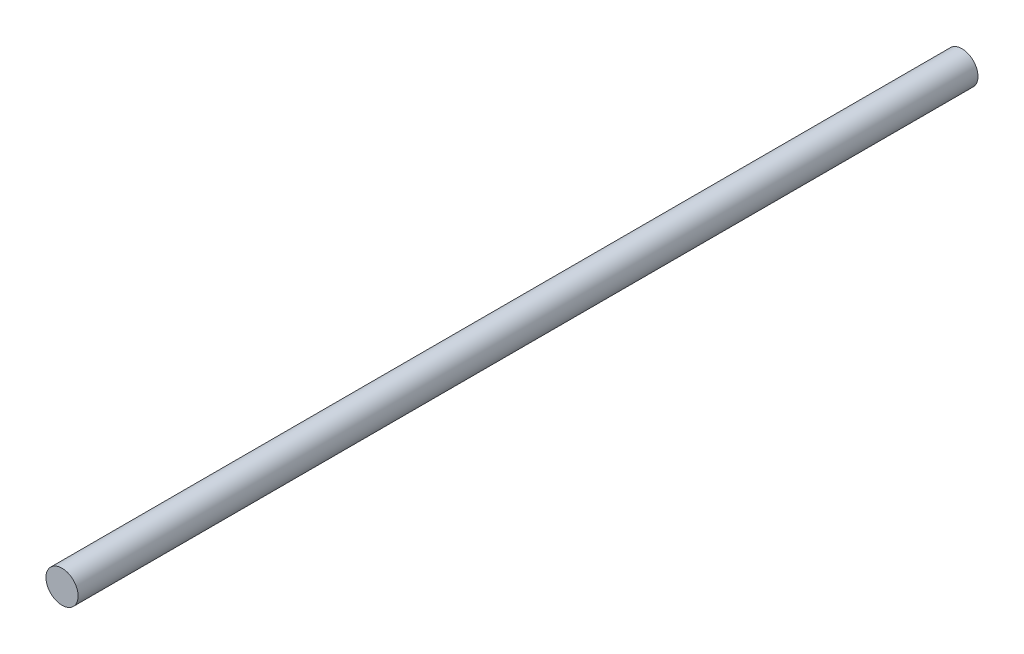
ISO-10303-21;
HEADER;
FILE_DESCRIPTION(('STEP AP214'),'2;1');
FILE_NAME('part.step','',(''),(''),'','','');
FILE_SCHEMA(('AUTOMOTIVE_DESIGN { 1 0 10303 214 1 1 1 1 }'));
ENDSEC;
DATA;
#1=APPLICATION_CONTEXT('core data for automotive mechanical design processes');
#2=APPLICATION_PROTOCOL_DEFINITION('international standard','automotive_design',2000,#1);
#3=PRODUCT_CONTEXT('',#1,'mechanical');
#4=PRODUCT('Part','Part','',(#3));
#5=PRODUCT_RELATED_PRODUCT_CATEGORY('part','',(#4));
#6=PRODUCT_DEFINITION_FORMATION('','',#4);
#7=PRODUCT_DEFINITION_CONTEXT('part definition',#1,'design');
#8=PRODUCT_DEFINITION('design','',#6,#7);
#9=PRODUCT_DEFINITION_SHAPE('','',#8);
#10=(LENGTH_UNIT() NAMED_UNIT(*) SI_UNIT(.MILLI.,.METRE.));
#11=(NAMED_UNIT(*) PLANE_ANGLE_UNIT() SI_UNIT($,.RADIAN.));
#12=(NAMED_UNIT(*) SI_UNIT($,.STERADIAN.) SOLID_ANGLE_UNIT());
#13=UNCERTAINTY_MEASURE_WITH_UNIT(LENGTH_MEASURE(1.E-05),#10,'distance_accuracy_value','');
#14=(GEOMETRIC_REPRESENTATION_CONTEXT(3) GLOBAL_UNCERTAINTY_ASSIGNED_CONTEXT((#13)) GLOBAL_UNIT_ASSIGNED_CONTEXT((#10,
#11,#12)) REPRESENTATION_CONTEXT('',''));
#15=CARTESIAN_POINT('',(0.,0.,0.));
#16=DIRECTION('',(0.,0.,1.));
#17=DIRECTION('',(1.,0.,0.));
#18=AXIS2_PLACEMENT_3D('',#15,#16,#17);
#19=CARTESIAN_POINT('',(0.,0.,355.6));
#20=DIRECTION('',(0.,0.,-1.));
#21=DIRECTION('',(-1.,0.,0.));
#22=AXIS2_PLACEMENT_3D('',#19,#20,#21);
#23=CYLINDRICAL_SURFACE('',#22,6.35);
#24=CARTESIAN_POINT('',(0.,0.,355.6));
#25=DIRECTION('',(0.,0.,1.));
#26=DIRECTION('',(1.,0.,0.));
#27=AXIS2_PLACEMENT_3D('',#24,#25,#26);
#28=CIRCLE('',#27,6.35);
#29=CARTESIAN_POINT('',(6.35,0.,355.6));
#30=VERTEX_POINT('',#29);
#31=EDGE_CURVE('E10',#30,#30,#28,.T.);
#32=ORIENTED_EDGE('',*,*,#31,.F.);
#33=EDGE_LOOP('',(#32));
#34=FACE_BOUND('',#33,.T.);
#35=CARTESIAN_POINT('',(0.,0.,0.));
#36=DIRECTION('',(0.,0.,1.));
#37=DIRECTION('',(1.,0.,0.));
#38=AXIS2_PLACEMENT_3D('',#35,#36,#37);
#39=CIRCLE('',#38,6.35);
#40=CARTESIAN_POINT('',(6.35,0.,0.));
#41=VERTEX_POINT('',#40);
#42=EDGE_CURVE('E34',#41,#41,#39,.T.);
#43=ORIENTED_EDGE('',*,*,#42,.T.);
#44=EDGE_LOOP('',(#43));
#45=FACE_BOUND('',#44,.T.);
#46=ADVANCED_FACE('F31',(#34,#45),#23,.T.);
#47=CARTESIAN_POINT('',(0.,0.,355.6));
#48=DIRECTION('',(0.,0.,1.));
#49=DIRECTION('',(1.,0.,0.));
#50=AXIS2_PLACEMENT_3D('',#47,#48,#49);
#51=PLANE('',#50);
#52=ORIENTED_EDGE('',*,*,#31,.T.);
#53=EDGE_LOOP('',(#52));
#54=FACE_BOUND('',#53,.T.);
#55=ADVANCED_FACE('F46',(#54),#51,.T.);
#56=CARTESIAN_POINT('',(0.,0.,0.));
#57=DIRECTION('',(0.,0.,1.));
#58=DIRECTION('',(1.,0.,0.));
#59=AXIS2_PLACEMENT_3D('',#56,#57,#58);
#60=PLANE('',#59);
#61=ORIENTED_EDGE('',*,*,#42,.F.);
#62=EDGE_LOOP('',(#61));
#63=FACE_BOUND('',#62,.T.);
#64=ADVANCED_FACE('F44',(#63),#60,.F.);
#65=CLOSED_SHELL('',(#46,#55,#64));
#66=MANIFOLD_SOLID_BREP('B2',#65);
#67=ADVANCED_BREP_SHAPE_REPRESENTATION('',(#18,#66),#14);
#68=SHAPE_DEFINITION_REPRESENTATION(#9,#67);
ENDSEC;
END-ISO-10303-21;
